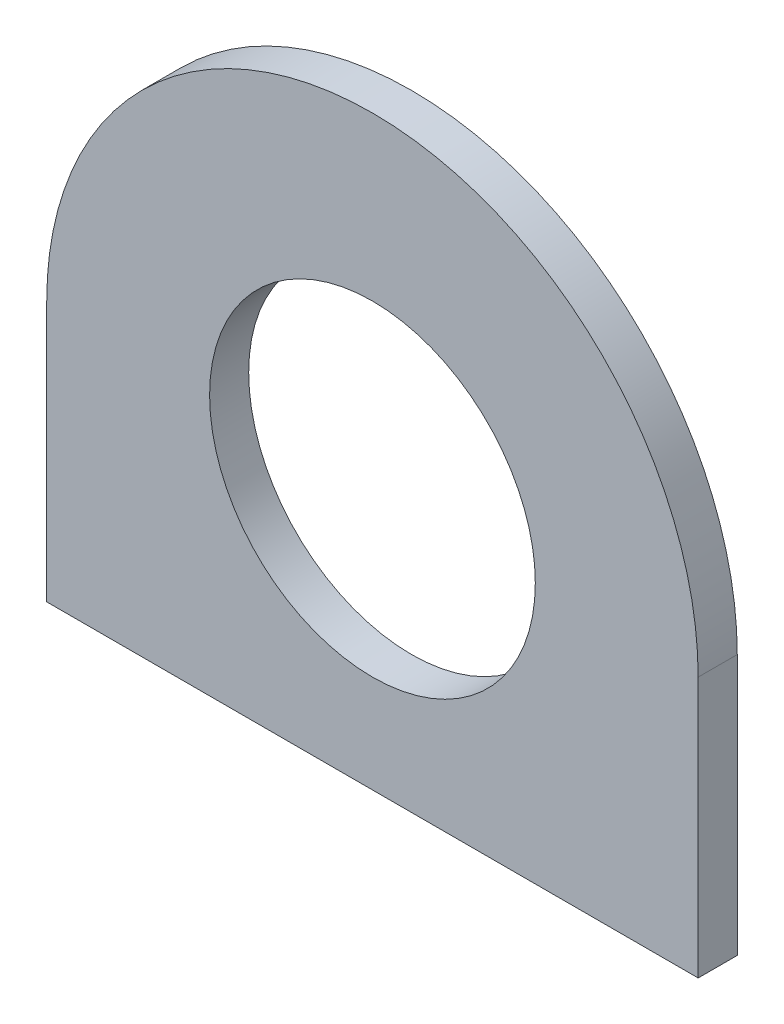
ISO-10303-21;
HEADER;
FILE_DESCRIPTION(('STEP AP214'),'2;1');
FILE_NAME('part.step','',(''),(''),'','','');
FILE_SCHEMA(('AUTOMOTIVE_DESIGN { 1 0 10303 214 1 1 1 1 }'));
ENDSEC;
DATA;
#1=APPLICATION_CONTEXT('core data for automotive mechanical design processes');
#2=APPLICATION_PROTOCOL_DEFINITION('international standard','automotive_design',2000,#1);
#3=PRODUCT_CONTEXT('',#1,'mechanical');
#4=PRODUCT('Part','Part','',(#3));
#5=PRODUCT_RELATED_PRODUCT_CATEGORY('part','',(#4));
#6=PRODUCT_DEFINITION_FORMATION('','',#4);
#7=PRODUCT_DEFINITION_CONTEXT('part definition',#1,'design');
#8=PRODUCT_DEFINITION('design','',#6,#7);
#9=PRODUCT_DEFINITION_SHAPE('','',#8);
#10=(LENGTH_UNIT() NAMED_UNIT(*) SI_UNIT(.MILLI.,.METRE.));
#11=(NAMED_UNIT(*) PLANE_ANGLE_UNIT() SI_UNIT($,.RADIAN.));
#12=(NAMED_UNIT(*) SI_UNIT($,.STERADIAN.) SOLID_ANGLE_UNIT());
#13=UNCERTAINTY_MEASURE_WITH_UNIT(LENGTH_MEASURE(1.E-05),#10,'distance_accuracy_value','');
#14=(GEOMETRIC_REPRESENTATION_CONTEXT(3) GLOBAL_UNCERTAINTY_ASSIGNED_CONTEXT((#13)) GLOBAL_UNIT_ASSIGNED_CONTEXT((#10,
#11,#12)) REPRESENTATION_CONTEXT('',''));
#15=CARTESIAN_POINT('',(0.,0.,0.));
#16=DIRECTION('',(0.,0.,1.));
#17=DIRECTION('',(1.,0.,0.));
#18=AXIS2_PLACEMENT_3D('',#15,#16,#17);
#19=CARTESIAN_POINT('',(0.,0.,6.));
#20=DIRECTION('',(0.,0.,1.));
#21=DIRECTION('',(1.,0.,0.));
#22=AXIS2_PLACEMENT_3D('',#19,#20,#21);
#23=PLANE('',#22);
#24=CARTESIAN_POINT('',(0.,0.,6.));
#25=DIRECTION('',(0.,0.,1.));
#26=DIRECTION('',(1.,0.,0.));
#27=AXIS2_PLACEMENT_3D('',#24,#25,#26);
#28=CIRCLE('',#27,50.);
#29=CARTESIAN_POINT('',(50.,0.,6.));
#30=VERTEX_POINT('',#29);
#31=CARTESIAN_POINT('',(-50.,0.,6.));
#32=VERTEX_POINT('',#31);
#33=EDGE_CURVE('E93',#30,#32,#28,.T.);
#34=ORIENTED_EDGE('',*,*,#33,.T.);
#35=DIRECTION('',(0.,-1.,0.));
#36=VECTOR('',#35,1.);
#37=CARTESIAN_POINT('',(-50.,0.,6.));
#38=LINE('',#37,#36);
#39=CARTESIAN_POINT('',(-50.,-40.,6.));
#40=VERTEX_POINT('',#39);
#41=EDGE_CURVE('E88',#32,#40,#38,.T.);
#42=ORIENTED_EDGE('',*,*,#41,.T.);
#43=DIRECTION('',(1.,0.,0.));
#44=VECTOR('',#43,1.);
#45=CARTESIAN_POINT('',(-50.,-40.,6.));
#46=LINE('',#45,#44);
#47=CARTESIAN_POINT('',(50.,-40.,6.));
#48=VERTEX_POINT('',#47);
#49=EDGE_CURVE('E91',#40,#48,#46,.T.);
#50=ORIENTED_EDGE('',*,*,#49,.T.);
#51=DIRECTION('',(0.,1.,0.));
#52=VECTOR('',#51,1.);
#53=CARTESIAN_POINT('',(50.,-40.,6.));
#54=LINE('',#53,#52);
#55=EDGE_CURVE('E58',#48,#30,#54,.T.);
#56=ORIENTED_EDGE('',*,*,#55,.T.);
#57=EDGE_LOOP('',(#34,#42,#50,#56));
#58=FACE_BOUND('',#57,.T.);
#59=CARTESIAN_POINT('',(0.,0.,6.));
#60=DIRECTION('',(0.,0.,1.));
#61=DIRECTION('',(1.,0.,0.));
#62=AXIS2_PLACEMENT_3D('',#59,#60,#61);
#63=CIRCLE('',#62,25.);
#64=CARTESIAN_POINT('',(25.,0.,6.));
#65=VERTEX_POINT('',#64);
#66=EDGE_CURVE('E108',#65,#65,#63,.T.);
#67=ORIENTED_EDGE('',*,*,#66,.F.);
#68=EDGE_LOOP('',(#67));
#69=FACE_BOUND('',#68,.T.);
#70=ADVANCED_FACE('F41',(#58,#69),#23,.T.);
#71=CARTESIAN_POINT('',(0.,0.,0.));
#72=DIRECTION('',(0.,0.,1.));
#73=DIRECTION('',(1.,0.,0.));
#74=AXIS2_PLACEMENT_3D('',#71,#72,#73);
#75=PLANE('',#74);
#76=CARTESIAN_POINT('',(0.,0.,0.));
#77=DIRECTION('',(0.,0.,1.));
#78=DIRECTION('',(1.,0.,0.));
#79=AXIS2_PLACEMENT_3D('',#76,#77,#78);
#80=CIRCLE('',#79,50.);
#81=CARTESIAN_POINT('',(50.,0.,0.));
#82=VERTEX_POINT('',#81);
#83=CARTESIAN_POINT('',(-50.,0.,0.));
#84=VERTEX_POINT('',#83);
#85=EDGE_CURVE('E105',#82,#84,#80,.T.);
#86=ORIENTED_EDGE('',*,*,#85,.F.);
#87=DIRECTION('',(0.,1.,0.));
#88=VECTOR('',#87,1.);
#89=CARTESIAN_POINT('',(50.,-40.,0.));
#90=LINE('',#89,#88);
#91=CARTESIAN_POINT('',(50.,-40.,0.));
#92=VERTEX_POINT('',#91);
#93=EDGE_CURVE('E81',#92,#82,#90,.T.);
#94=ORIENTED_EDGE('',*,*,#93,.F.);
#95=DIRECTION('',(1.,0.,0.));
#96=VECTOR('',#95,1.);
#97=CARTESIAN_POINT('',(-50.,-40.,0.));
#98=LINE('',#97,#96);
#99=CARTESIAN_POINT('',(-50.,-40.,0.));
#100=VERTEX_POINT('',#99);
#101=EDGE_CURVE('E75',#100,#92,#98,.T.);
#102=ORIENTED_EDGE('',*,*,#101,.F.);
#103=DIRECTION('',(0.,-1.,0.));
#104=VECTOR('',#103,1.);
#105=CARTESIAN_POINT('',(-50.,0.,0.));
#106=LINE('',#105,#104);
#107=EDGE_CURVE('E97',#84,#100,#106,.T.);
#108=ORIENTED_EDGE('',*,*,#107,.F.);
#109=EDGE_LOOP('',(#86,#94,#102,#108));
#110=FACE_BOUND('',#109,.T.);
#111=CARTESIAN_POINT('',(0.,0.,0.));
#112=DIRECTION('',(0.,0.,1.));
#113=DIRECTION('',(1.,0.,0.));
#114=AXIS2_PLACEMENT_3D('',#111,#112,#113);
#115=CIRCLE('',#114,25.);
#116=CARTESIAN_POINT('',(25.,0.,0.));
#117=VERTEX_POINT('',#116);
#118=EDGE_CURVE('E120',#117,#117,#115,.T.);
#119=ORIENTED_EDGE('',*,*,#118,.T.);
#120=EDGE_LOOP('',(#119));
#121=FACE_BOUND('',#120,.T.);
#122=ADVANCED_FACE('F116',(#110,#121),#75,.F.);
#123=CARTESIAN_POINT('',(0.,0.,6.));
#124=DIRECTION('',(0.,0.,-1.));
#125=DIRECTION('',(-1.,0.,0.));
#126=AXIS2_PLACEMENT_3D('',#123,#124,#125);
#127=CYLINDRICAL_SURFACE('',#126,50.);
#128=ORIENTED_EDGE('',*,*,#85,.T.);
#129=DIRECTION('',(0.,0.,-1.));
#130=VECTOR('',#129,1.);
#131=CARTESIAN_POINT('',(-50.,0.,6.));
#132=LINE('',#131,#130);
#133=EDGE_CURVE('E11',#32,#84,#132,.T.);
#134=ORIENTED_EDGE('',*,*,#133,.F.);
#135=ORIENTED_EDGE('',*,*,#33,.F.);
#136=DIRECTION('',(0.,0.,-1.));
#137=VECTOR('',#136,1.);
#138=CARTESIAN_POINT('',(50.,0.,6.));
#139=LINE('',#138,#137);
#140=EDGE_CURVE('E101',#30,#82,#139,.T.);
#141=ORIENTED_EDGE('',*,*,#140,.T.);
#142=EDGE_LOOP('',(#128,#134,#135,#141));
#143=FACE_BOUND('',#142,.T.);
#144=ADVANCED_FACE('F43',(#143),#127,.T.);
#145=CARTESIAN_POINT('',(-50.,0.,6.));
#146=DIRECTION('',(1.,0.,0.));
#147=DIRECTION('',(0.,1.,0.));
#148=AXIS2_PLACEMENT_3D('',#145,#146,#147);
#149=PLANE('',#148);
#150=ORIENTED_EDGE('',*,*,#107,.T.);
#151=DIRECTION('',(0.,0.,-1.));
#152=VECTOR('',#151,1.);
#153=CARTESIAN_POINT('',(-50.,-40.,6.));
#154=LINE('',#153,#152);
#155=EDGE_CURVE('E50',#40,#100,#154,.T.);
#156=ORIENTED_EDGE('',*,*,#155,.F.);
#157=ORIENTED_EDGE('',*,*,#41,.F.);
#158=ORIENTED_EDGE('',*,*,#133,.T.);
#159=EDGE_LOOP('',(#150,#156,#157,#158));
#160=FACE_BOUND('',#159,.T.);
#161=ADVANCED_FACE('F96',(#160),#149,.F.);
#162=CARTESIAN_POINT('',(-50.,-40.,6.));
#163=DIRECTION('',(0.,1.,0.));
#164=DIRECTION('',(0.,0.,1.));
#165=AXIS2_PLACEMENT_3D('',#162,#163,#164);
#166=PLANE('',#165);
#167=ORIENTED_EDGE('',*,*,#101,.T.);
#168=DIRECTION('',(0.,0.,-1.));
#169=VECTOR('',#168,1.);
#170=CARTESIAN_POINT('',(50.,-40.,6.));
#171=LINE('',#170,#169);
#172=EDGE_CURVE('E98',#48,#92,#171,.T.);
#173=ORIENTED_EDGE('',*,*,#172,.F.);
#174=ORIENTED_EDGE('',*,*,#49,.F.);
#175=ORIENTED_EDGE('',*,*,#155,.T.);
#176=EDGE_LOOP('',(#167,#173,#174,#175));
#177=FACE_BOUND('',#176,.T.);
#178=ADVANCED_FACE('F99',(#177),#166,.F.);
#179=CARTESIAN_POINT('',(50.,-40.,6.));
#180=DIRECTION('',(-1.,0.,0.));
#181=DIRECTION('',(0.,-1.,0.));
#182=AXIS2_PLACEMENT_3D('',#179,#180,#181);
#183=PLANE('',#182);
#184=ORIENTED_EDGE('',*,*,#93,.T.);
#185=ORIENTED_EDGE('',*,*,#140,.F.);
#186=ORIENTED_EDGE('',*,*,#55,.F.);
#187=ORIENTED_EDGE('',*,*,#172,.T.);
#188=EDGE_LOOP('',(#184,#185,#186,#187));
#189=FACE_BOUND('',#188,.T.);
#190=ADVANCED_FACE('F113',(#189),#183,.F.);
#191=CARTESIAN_POINT('',(0.,0.,6.));
#192=DIRECTION('',(0.,0.,-1.));
#193=DIRECTION('',(-1.,0.,0.));
#194=AXIS2_PLACEMENT_3D('',#191,#192,#193);
#195=CYLINDRICAL_SURFACE('',#194,25.);
#196=ORIENTED_EDGE('',*,*,#66,.T.);
#197=EDGE_LOOP('',(#196));
#198=FACE_BOUND('',#197,.T.);
#199=ORIENTED_EDGE('',*,*,#118,.F.);
#200=EDGE_LOOP('',(#199));
#201=FACE_BOUND('',#200,.T.);
#202=ADVANCED_FACE('F126',(#198,#201),#195,.F.);
#203=CLOSED_SHELL('',(#70,#122,#144,#161,#178,#190,#202));
#204=MANIFOLD_SOLID_BREP('B2',#203);
#205=ADVANCED_BREP_SHAPE_REPRESENTATION('',(#18,#204),#14);
#206=SHAPE_DEFINITION_REPRESENTATION(#9,#205);
ENDSEC;
END-ISO-10303-21;
